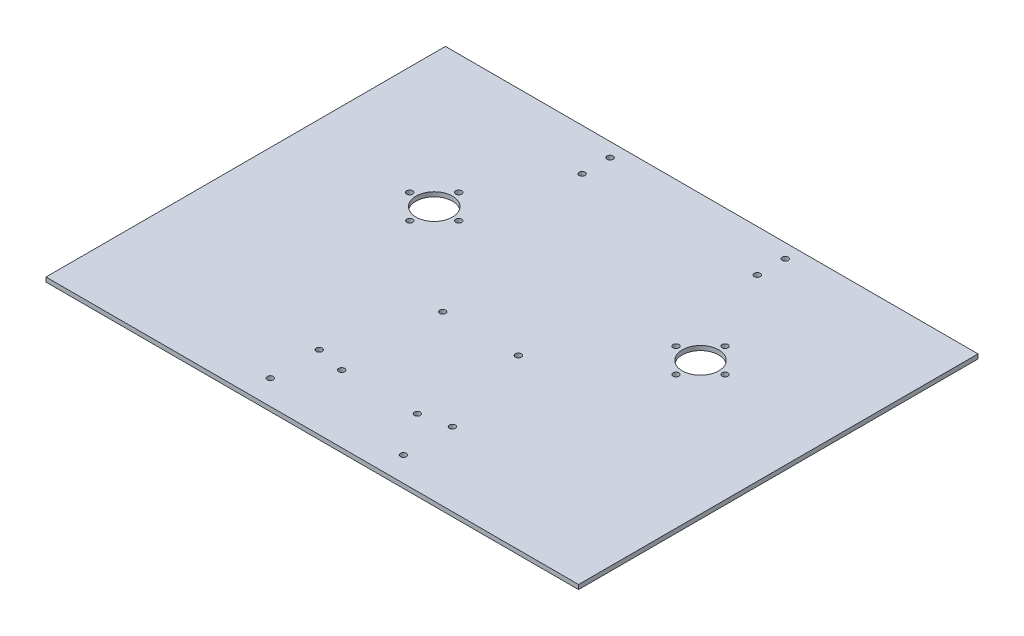
ISO-10303-21;
HEADER;
FILE_DESCRIPTION(('STEP AP214'),'2;1');
FILE_NAME('part.step','',(''),(''),'','','');
FILE_SCHEMA(('AUTOMOTIVE_DESIGN { 1 0 10303 214 1 1 1 1 }'));
ENDSEC;
DATA;
#1=APPLICATION_CONTEXT('core data for automotive mechanical design processes');
#2=APPLICATION_PROTOCOL_DEFINITION('international standard','automotive_design',2000,#1);
#3=PRODUCT_CONTEXT('',#1,'mechanical');
#4=PRODUCT('Part','Part','',(#3));
#5=PRODUCT_RELATED_PRODUCT_CATEGORY('part','',(#4));
#6=PRODUCT_DEFINITION_FORMATION('','',#4);
#7=PRODUCT_DEFINITION_CONTEXT('part definition',#1,'design');
#8=PRODUCT_DEFINITION('design','',#6,#7);
#9=PRODUCT_DEFINITION_SHAPE('','',#8);
#10=(LENGTH_UNIT() NAMED_UNIT(*) SI_UNIT(.MILLI.,.METRE.));
#11=(NAMED_UNIT(*) PLANE_ANGLE_UNIT() SI_UNIT($,.RADIAN.));
#12=(NAMED_UNIT(*) SI_UNIT($,.STERADIAN.) SOLID_ANGLE_UNIT());
#13=UNCERTAINTY_MEASURE_WITH_UNIT(LENGTH_MEASURE(1.E-05),#10,'distance_accuracy_value','');
#14=(GEOMETRIC_REPRESENTATION_CONTEXT(3) GLOBAL_UNCERTAINTY_ASSIGNED_CONTEXT((#13)) GLOBAL_UNIT_ASSIGNED_CONTEXT((#10,
#11,#12)) REPRESENTATION_CONTEXT('',''));
#15=CARTESIAN_POINT('',(0.,0.,0.));
#16=DIRECTION('',(0.,0.,1.));
#17=DIRECTION('',(1.,0.,0.));
#18=AXIS2_PLACEMENT_3D('',#15,#16,#17);
#19=CARTESIAN_POINT('',(0.,3.175,0.));
#20=DIRECTION('',(0.,-1.,0.));
#21=DIRECTION('',(0.,0.,-1.));
#22=AXIS2_PLACEMENT_3D('',#19,#20,#21);
#23=PLANE('',#22);
#24=DIRECTION('',(0.,0.,-1.));
#25=VECTOR('',#24,1.);
#26=CARTESIAN_POINT('',(190.,3.175,142.5));
#27=LINE('',#26,#25);
#28=CARTESIAN_POINT('',(190.,3.175,142.5));
#29=VERTEX_POINT('',#28);
#30=CARTESIAN_POINT('',(190.,3.175,-142.5));
#31=VERTEX_POINT('',#30);
#32=EDGE_CURVE('E98',#29,#31,#27,.T.);
#33=ORIENTED_EDGE('',*,*,#32,.T.);
#34=DIRECTION('',(-1.,0.,0.));
#35=VECTOR('',#34,1.);
#36=CARTESIAN_POINT('',(-190.,3.175,-142.5));
#37=LINE('',#36,#35);
#38=CARTESIAN_POINT('',(-190.,3.175,-142.5));
#39=VERTEX_POINT('',#38);
#40=EDGE_CURVE('E93',#31,#39,#37,.T.);
#41=ORIENTED_EDGE('',*,*,#40,.T.);
#42=DIRECTION('',(0.,0.,1.));
#43=VECTOR('',#42,1.);
#44=CARTESIAN_POINT('',(-190.,3.175,142.5));
#45=LINE('',#44,#43);
#46=CARTESIAN_POINT('',(-190.,3.175,142.5));
#47=VERTEX_POINT('',#46);
#48=EDGE_CURVE('E96',#39,#47,#45,.T.);
#49=ORIENTED_EDGE('',*,*,#48,.T.);
#50=DIRECTION('',(1.,0.,0.));
#51=VECTOR('',#50,1.);
#52=CARTESIAN_POINT('',(-190.,3.175,142.5));
#53=LINE('',#52,#51);
#54=EDGE_CURVE('E63',#47,#29,#53,.T.);
#55=ORIENTED_EDGE('',*,*,#54,.T.);
#56=EDGE_LOOP('',(#33,#41,#49,#55));
#57=FACE_BOUND('',#56,.T.);
#58=CARTESIAN_POINT('',(-95.,3.175,-39.5));
#59=DIRECTION('',(0.,1.,0.));
#60=DIRECTION('',(0.,0.,1.));
#61=AXIS2_PLACEMENT_3D('',#58,#59,#60);
#62=CIRCLE('',#61,13.);
#63=CARTESIAN_POINT('',(-95.,3.175,-26.5));
#64=VERTEX_POINT('',#63);
#65=EDGE_CURVE('E118',#64,#64,#62,.T.);
#66=ORIENTED_EDGE('',*,*,#65,.F.);
#67=EDGE_LOOP('',(#66));
#68=FACE_BOUND('',#67,.T.);
#69=CARTESIAN_POINT('',(-112.5,3.175,-39.4999999999999));
#70=DIRECTION('',(0.,1.,0.));
#71=DIRECTION('',(0.,0.,1.));
#72=AXIS2_PLACEMENT_3D('',#69,#70,#71);
#73=CIRCLE('',#72,2.125);
#74=CARTESIAN_POINT('',(-112.5,3.175,-37.3749999999999));
#75=VERTEX_POINT('',#74);
#76=EDGE_CURVE('E140',#75,#75,#73,.T.);
#77=ORIENTED_EDGE('',*,*,#76,.F.);
#78=EDGE_LOOP('',(#77));
#79=FACE_BOUND('',#78,.T.);
#80=CARTESIAN_POINT('',(-47.5,3.175,125.));
#81=DIRECTION('',(0.,1.,0.));
#82=DIRECTION('',(0.,0.,1.));
#83=AXIS2_PLACEMENT_3D('',#80,#81,#82);
#84=CIRCLE('',#83,2.125);
#85=CARTESIAN_POINT('',(-47.5,3.175,127.125));
#86=VERTEX_POINT('',#85);
#87=EDGE_CURVE('E148',#86,#86,#84,.T.);
#88=ORIENTED_EDGE('',*,*,#87,.F.);
#89=EDGE_LOOP('',(#88));
#90=FACE_BOUND('',#89,.T.);
#91=CARTESIAN_POINT('',(-62.5,3.175,-132.5));
#92=DIRECTION('',(0.,1.,0.));
#93=DIRECTION('',(0.,0.,1.));
#94=AXIS2_PLACEMENT_3D('',#91,#92,#93);
#95=CIRCLE('',#94,2.125);
#96=CARTESIAN_POINT('',(-62.5,3.175,-130.375));
#97=VERTEX_POINT('',#96);
#98=EDGE_CURVE('E156',#97,#97,#95,.T.);
#99=ORIENTED_EDGE('',*,*,#98,.F.);
#100=EDGE_LOOP('',(#99));
#101=FACE_BOUND('',#100,.T.);
#102=CARTESIAN_POINT('',(-95.,3.175,-57.));
#103=DIRECTION('',(0.,1.,0.));
#104=DIRECTION('',(0.,0.,1.));
#105=AXIS2_PLACEMENT_3D('',#102,#103,#104);
#106=CIRCLE('',#105,2.125);
#107=CARTESIAN_POINT('',(-95.,3.175,-54.875));
#108=VERTEX_POINT('',#107);
#109=EDGE_CURVE('E164',#108,#108,#106,.T.);
#110=ORIENTED_EDGE('',*,*,#109,.F.);
#111=EDGE_LOOP('',(#110));
#112=FACE_BOUND('',#111,.T.);
#113=CARTESIAN_POINT('',(-47.4999999999999,3.175,90.));
#114=DIRECTION('',(0.,1.,0.));
#115=DIRECTION('',(0.,0.,1.));
#116=AXIS2_PLACEMENT_3D('',#113,#114,#115);
#117=CIRCLE('',#116,2.125);
#118=CARTESIAN_POINT('',(-47.4999999999999,3.175,92.125));
#119=VERTEX_POINT('',#118);
#120=EDGE_CURVE('E172',#119,#119,#117,.T.);
#121=ORIENTED_EDGE('',*,*,#120,.F.);
#122=EDGE_LOOP('',(#121));
#123=FACE_BOUND('',#122,.T.);
#124=CARTESIAN_POINT('',(-77.5,3.175,-39.5));
#125=DIRECTION('',(0.,1.,0.));
#126=DIRECTION('',(0.,0.,1.));
#127=AXIS2_PLACEMENT_3D('',#124,#125,#126);
#128=CIRCLE('',#127,2.125);
#129=CARTESIAN_POINT('',(-77.5,3.175,-37.375));
#130=VERTEX_POINT('',#129);
#131=EDGE_CURVE('E180',#130,#130,#128,.T.);
#132=ORIENTED_EDGE('',*,*,#131,.F.);
#133=EDGE_LOOP('',(#132));
#134=FACE_BOUND('',#133,.T.);
#135=CARTESIAN_POINT('',(-95.0000000000001,3.175,-22.));
#136=DIRECTION('',(0.,1.,0.));
#137=DIRECTION('',(0.,0.,1.));
#138=AXIS2_PLACEMENT_3D('',#135,#136,#137);
#139=CIRCLE('',#138,2.125);
#140=CARTESIAN_POINT('',(-95.0000000000001,3.175,-19.875));
#141=VERTEX_POINT('',#140);
#142=EDGE_CURVE('E188',#141,#141,#139,.T.);
#143=ORIENTED_EDGE('',*,*,#142,.F.);
#144=EDGE_LOOP('',(#143));
#145=FACE_BOUND('',#144,.T.);
#146=CARTESIAN_POINT('',(-62.5,3.175,-112.5));
#147=DIRECTION('',(0.,1.,0.));
#148=DIRECTION('',(0.,0.,1.));
#149=AXIS2_PLACEMENT_3D('',#146,#147,#148);
#150=CIRCLE('',#149,2.125);
#151=CARTESIAN_POINT('',(-62.5,3.175,-110.375));
#152=VERTEX_POINT('',#151);
#153=EDGE_CURVE('E196',#152,#152,#150,.T.);
#154=ORIENTED_EDGE('',*,*,#153,.F.);
#155=EDGE_LOOP('',(#154));
#156=FACE_BOUND('',#155,.T.);
#157=CARTESIAN_POINT('',(47.5,3.175,90.));
#158=DIRECTION('',(0.,1.,0.));
#159=DIRECTION('',(0.,0.,-1.));
#160=AXIS2_PLACEMENT_3D('',#157,#158,#159);
#161=CIRCLE('',#160,2.125);
#162=CARTESIAN_POINT('',(47.5,3.175,87.875));
#163=VERTEX_POINT('',#162);
#164=EDGE_CURVE('E204',#163,#163,#161,.T.);
#165=ORIENTED_EDGE('',*,*,#164,.F.);
#166=EDGE_LOOP('',(#165));
#167=FACE_BOUND('',#166,.T.);
#168=CARTESIAN_POINT('',(47.5,3.175,125.));
#169=DIRECTION('',(0.,1.,0.));
#170=DIRECTION('',(0.,0.,-1.));
#171=AXIS2_PLACEMENT_3D('',#168,#169,#170);
#172=CIRCLE('',#171,2.125);
#173=CARTESIAN_POINT('',(47.5,3.175,122.875));
#174=VERTEX_POINT('',#173);
#175=EDGE_CURVE('E212',#174,#174,#172,.T.);
#176=ORIENTED_EDGE('',*,*,#175,.F.);
#177=EDGE_LOOP('',(#176));
#178=FACE_BOUND('',#177,.T.);
#179=CARTESIAN_POINT('',(95.0000000000001,3.175,-22.));
#180=DIRECTION('',(0.,1.,0.));
#181=DIRECTION('',(0.,0.,-1.));
#182=AXIS2_PLACEMENT_3D('',#179,#180,#181);
#183=CIRCLE('',#182,2.125);
#184=CARTESIAN_POINT('',(95.0000000000001,3.175,-24.125));
#185=VERTEX_POINT('',#184);
#186=EDGE_CURVE('E220',#185,#185,#183,.T.);
#187=ORIENTED_EDGE('',*,*,#186,.F.);
#188=EDGE_LOOP('',(#187));
#189=FACE_BOUND('',#188,.T.);
#190=CARTESIAN_POINT('',(77.4999999999999,3.175,-39.5));
#191=DIRECTION('',(0.,1.,0.));
#192=DIRECTION('',(0.,0.,-1.));
#193=AXIS2_PLACEMENT_3D('',#190,#191,#192);
#194=CIRCLE('',#193,2.125);
#195=CARTESIAN_POINT('',(77.4999999999999,3.175,-41.625));
#196=VERTEX_POINT('',#195);
#197=EDGE_CURVE('E228',#196,#196,#194,.T.);
#198=ORIENTED_EDGE('',*,*,#197,.F.);
#199=EDGE_LOOP('',(#198));
#200=FACE_BOUND('',#199,.T.);
#201=CARTESIAN_POINT('',(112.5,3.175,-39.4999999999999));
#202=DIRECTION('',(0.,1.,0.));
#203=DIRECTION('',(0.,0.,-1.));
#204=AXIS2_PLACEMENT_3D('',#201,#202,#203);
#205=CIRCLE('',#204,2.125);
#206=CARTESIAN_POINT('',(112.5,3.175,-41.625));
#207=VERTEX_POINT('',#206);
#208=EDGE_CURVE('E236',#207,#207,#205,.T.);
#209=ORIENTED_EDGE('',*,*,#208,.F.);
#210=EDGE_LOOP('',(#209));
#211=FACE_BOUND('',#210,.T.);
#212=CARTESIAN_POINT('',(94.9999999999999,3.175,-57.));
#213=DIRECTION('',(0.,1.,0.));
#214=DIRECTION('',(0.,0.,-1.));
#215=AXIS2_PLACEMENT_3D('',#212,#213,#214);
#216=CIRCLE('',#215,2.125);
#217=CARTESIAN_POINT('',(94.9999999999999,3.175,-59.125));
#218=VERTEX_POINT('',#217);
#219=EDGE_CURVE('E244',#218,#218,#216,.T.);
#220=ORIENTED_EDGE('',*,*,#219,.F.);
#221=EDGE_LOOP('',(#220));
#222=FACE_BOUND('',#221,.T.);
#223=CARTESIAN_POINT('',(94.9999999999999,3.175,-39.5));
#224=DIRECTION('',(0.,1.,0.));
#225=DIRECTION('',(0.,0.,-1.));
#226=AXIS2_PLACEMENT_3D('',#223,#224,#225);
#227=CIRCLE('',#226,13.);
#228=CARTESIAN_POINT('',(94.9999999999999,3.175,-52.5));
#229=VERTEX_POINT('',#228);
#230=EDGE_CURVE('E252',#229,#229,#227,.T.);
#231=ORIENTED_EDGE('',*,*,#230,.F.);
#232=EDGE_LOOP('',(#231));
#233=FACE_BOUND('',#232,.T.);
#234=CARTESIAN_POINT('',(62.4999999999999,3.175,-112.5));
#235=DIRECTION('',(0.,1.,0.));
#236=DIRECTION('',(0.,0.,-1.));
#237=AXIS2_PLACEMENT_3D('',#234,#235,#236);
#238=CIRCLE('',#237,2.125);
#239=CARTESIAN_POINT('',(62.4999999999999,3.175,-114.625));
#240=VERTEX_POINT('',#239);
#241=EDGE_CURVE('E260',#240,#240,#238,.T.);
#242=ORIENTED_EDGE('',*,*,#241,.F.);
#243=EDGE_LOOP('',(#242));
#244=FACE_BOUND('',#243,.T.);
#245=CARTESIAN_POINT('',(62.4999999999999,3.175,-132.5));
#246=DIRECTION('',(0.,1.,0.));
#247=DIRECTION('',(0.,0.,-1.));
#248=AXIS2_PLACEMENT_3D('',#245,#246,#247);
#249=CIRCLE('',#248,2.125);
#250=CARTESIAN_POINT('',(62.4999999999999,3.175,-134.625));
#251=VERTEX_POINT('',#250);
#252=EDGE_CURVE('E268',#251,#251,#249,.T.);
#253=ORIENTED_EDGE('',*,*,#252,.F.);
#254=EDGE_LOOP('',(#253));
#255=FACE_BOUND('',#254,.T.);
#256=CARTESIAN_POINT('',(-27.,3.175,94.5));
#257=DIRECTION('',(0.,1.,0.));
#258=DIRECTION('',(0.,0.,1.));
#259=AXIS2_PLACEMENT_3D('',#256,#257,#258);
#260=CIRCLE('',#259,2.125);
#261=CARTESIAN_POINT('',(-27.,3.175,96.625));
#262=VERTEX_POINT('',#261);
#263=EDGE_CURVE('E276',#262,#262,#260,.T.);
#264=ORIENTED_EDGE('',*,*,#263,.F.);
#265=EDGE_LOOP('',(#264));
#266=FACE_BOUND('',#265,.T.);
#267=CARTESIAN_POINT('',(-27.,3.175,22.5));
#268=DIRECTION('',(0.,1.,0.));
#269=DIRECTION('',(0.,0.,1.));
#270=AXIS2_PLACEMENT_3D('',#267,#268,#269);
#271=CIRCLE('',#270,2.125);
#272=CARTESIAN_POINT('',(-27.,3.175,24.625));
#273=VERTEX_POINT('',#272);
#274=EDGE_CURVE('E284',#273,#273,#271,.T.);
#275=ORIENTED_EDGE('',*,*,#274,.F.);
#276=EDGE_LOOP('',(#275));
#277=FACE_BOUND('',#276,.T.);
#278=CARTESIAN_POINT('',(26.9999999999999,3.175,94.5));
#279=DIRECTION('',(0.,1.,0.));
#280=DIRECTION('',(0.,0.,-1.));
#281=AXIS2_PLACEMENT_3D('',#278,#279,#280);
#282=CIRCLE('',#281,2.125);
#283=CARTESIAN_POINT('',(26.9999999999999,3.175,92.375));
#284=VERTEX_POINT('',#283);
#285=EDGE_CURVE('E292',#284,#284,#282,.T.);
#286=ORIENTED_EDGE('',*,*,#285,.F.);
#287=EDGE_LOOP('',(#286));
#288=FACE_BOUND('',#287,.T.);
#289=CARTESIAN_POINT('',(26.9999999999999,3.175,22.5));
#290=DIRECTION('',(0.,1.,0.));
#291=DIRECTION('',(0.,0.,-1.));
#292=AXIS2_PLACEMENT_3D('',#289,#290,#291);
#293=CIRCLE('',#292,2.125);
#294=CARTESIAN_POINT('',(26.9999999999999,3.175,20.375));
#295=VERTEX_POINT('',#294);
#296=EDGE_CURVE('E300',#295,#295,#293,.T.);
#297=ORIENTED_EDGE('',*,*,#296,.F.);
#298=EDGE_LOOP('',(#297));
#299=FACE_BOUND('',#298,.T.);
#300=ADVANCED_FACE('F45',(#57,#68,#79,#90,#101,#112,#123,#134,#145,#156,#167,#178,#189,#200,
#211,#222,#233,#244,#255,#266,#277,#288,#299),#23,.F.);
#301=CARTESIAN_POINT('',(0.,0.,0.));
#302=DIRECTION('',(0.,-1.,0.));
#303=DIRECTION('',(0.,0.,-1.));
#304=AXIS2_PLACEMENT_3D('',#301,#302,#303);
#305=PLANE('',#304);
#306=CARTESIAN_POINT('',(26.9999999999999,0.,94.5));
#307=DIRECTION('',(0.,1.,0.));
#308=DIRECTION('',(0.,0.,-1.));
#309=AXIS2_PLACEMENT_3D('',#306,#307,#308);
#310=CIRCLE('',#309,2.125);
#311=CARTESIAN_POINT('',(26.9999999999999,0.,92.375));
#312=VERTEX_POINT('',#311);
#313=EDGE_CURVE('E296',#312,#312,#310,.T.);
#314=ORIENTED_EDGE('',*,*,#313,.T.);
#315=EDGE_LOOP('',(#314));
#316=FACE_BOUND('',#315,.T.);
#317=CARTESIAN_POINT('',(-27.,0.,94.5));
#318=DIRECTION('',(0.,1.,0.));
#319=DIRECTION('',(0.,0.,1.));
#320=AXIS2_PLACEMENT_3D('',#317,#318,#319);
#321=CIRCLE('',#320,2.125);
#322=CARTESIAN_POINT('',(-27.,0.,96.625));
#323=VERTEX_POINT('',#322);
#324=EDGE_CURVE('E280',#323,#323,#321,.T.);
#325=ORIENTED_EDGE('',*,*,#324,.T.);
#326=EDGE_LOOP('',(#325));
#327=FACE_BOUND('',#326,.T.);
#328=CARTESIAN_POINT('',(62.4999999999999,0.,-112.5));
#329=DIRECTION('',(0.,1.,0.));
#330=DIRECTION('',(0.,0.,-1.));
#331=AXIS2_PLACEMENT_3D('',#328,#329,#330);
#332=CIRCLE('',#331,2.125);
#333=CARTESIAN_POINT('',(62.4999999999999,0.,-114.625));
#334=VERTEX_POINT('',#333);
#335=EDGE_CURVE('E264',#334,#334,#332,.T.);
#336=ORIENTED_EDGE('',*,*,#335,.T.);
#337=EDGE_LOOP('',(#336));
#338=FACE_BOUND('',#337,.T.);
#339=CARTESIAN_POINT('',(94.9999999999999,0.,-57.));
#340=DIRECTION('',(0.,1.,0.));
#341=DIRECTION('',(0.,0.,-1.));
#342=AXIS2_PLACEMENT_3D('',#339,#340,#341);
#343=CIRCLE('',#342,2.125);
#344=CARTESIAN_POINT('',(94.9999999999999,0.,-59.125));
#345=VERTEX_POINT('',#344);
#346=EDGE_CURVE('E248',#345,#345,#343,.T.);
#347=ORIENTED_EDGE('',*,*,#346,.T.);
#348=EDGE_LOOP('',(#347));
#349=FACE_BOUND('',#348,.T.);
#350=CARTESIAN_POINT('',(77.4999999999999,0.,-39.5));
#351=DIRECTION('',(0.,1.,0.));
#352=DIRECTION('',(0.,0.,-1.));
#353=AXIS2_PLACEMENT_3D('',#350,#351,#352);
#354=CIRCLE('',#353,2.125);
#355=CARTESIAN_POINT('',(77.4999999999999,0.,-41.625));
#356=VERTEX_POINT('',#355);
#357=EDGE_CURVE('E232',#356,#356,#354,.T.);
#358=ORIENTED_EDGE('',*,*,#357,.T.);
#359=EDGE_LOOP('',(#358));
#360=FACE_BOUND('',#359,.T.);
#361=CARTESIAN_POINT('',(47.5,0.,125.));
#362=DIRECTION('',(0.,1.,0.));
#363=DIRECTION('',(0.,0.,-1.));
#364=AXIS2_PLACEMENT_3D('',#361,#362,#363);
#365=CIRCLE('',#364,2.125);
#366=CARTESIAN_POINT('',(47.5,0.,122.875));
#367=VERTEX_POINT('',#366);
#368=EDGE_CURVE('E216',#367,#367,#365,.T.);
#369=ORIENTED_EDGE('',*,*,#368,.T.);
#370=EDGE_LOOP('',(#369));
#371=FACE_BOUND('',#370,.T.);
#372=CARTESIAN_POINT('',(-62.5,0.,-112.5));
#373=DIRECTION('',(0.,1.,0.));
#374=DIRECTION('',(0.,0.,1.));
#375=AXIS2_PLACEMENT_3D('',#372,#373,#374);
#376=CIRCLE('',#375,2.125);
#377=CARTESIAN_POINT('',(-62.5,0.,-110.375));
#378=VERTEX_POINT('',#377);
#379=EDGE_CURVE('E200',#378,#378,#376,.T.);
#380=ORIENTED_EDGE('',*,*,#379,.T.);
#381=EDGE_LOOP('',(#380));
#382=FACE_BOUND('',#381,.T.);
#383=CARTESIAN_POINT('',(-77.5,0.,-39.5));
#384=DIRECTION('',(0.,1.,0.));
#385=DIRECTION('',(0.,0.,1.));
#386=AXIS2_PLACEMENT_3D('',#383,#384,#385);
#387=CIRCLE('',#386,2.125);
#388=CARTESIAN_POINT('',(-77.5,0.,-37.375));
#389=VERTEX_POINT('',#388);
#390=EDGE_CURVE('E184',#389,#389,#387,.T.);
#391=ORIENTED_EDGE('',*,*,#390,.T.);
#392=EDGE_LOOP('',(#391));
#393=FACE_BOUND('',#392,.T.);
#394=CARTESIAN_POINT('',(-95.,0.,-57.));
#395=DIRECTION('',(0.,1.,0.));
#396=DIRECTION('',(0.,0.,1.));
#397=AXIS2_PLACEMENT_3D('',#394,#395,#396);
#398=CIRCLE('',#397,2.125);
#399=CARTESIAN_POINT('',(-95.,0.,-54.875));
#400=VERTEX_POINT('',#399);
#401=EDGE_CURVE('E168',#400,#400,#398,.T.);
#402=ORIENTED_EDGE('',*,*,#401,.T.);
#403=EDGE_LOOP('',(#402));
#404=FACE_BOUND('',#403,.T.);
#405=CARTESIAN_POINT('',(-47.5,0.,125.));
#406=DIRECTION('',(0.,1.,0.));
#407=DIRECTION('',(0.,0.,1.));
#408=AXIS2_PLACEMENT_3D('',#405,#406,#407);
#409=CIRCLE('',#408,2.125);
#410=CARTESIAN_POINT('',(-47.5,0.,127.125));
#411=VERTEX_POINT('',#410);
#412=EDGE_CURVE('E152',#411,#411,#409,.T.);
#413=ORIENTED_EDGE('',*,*,#412,.T.);
#414=EDGE_LOOP('',(#413));
#415=FACE_BOUND('',#414,.T.);
#416=CARTESIAN_POINT('',(-95.,0.,-39.5));
#417=DIRECTION('',(0.,1.,0.));
#418=DIRECTION('',(0.,0.,1.));
#419=AXIS2_PLACEMENT_3D('',#416,#417,#418);
#420=CIRCLE('',#419,13.);
#421=CARTESIAN_POINT('',(-95.,0.,-26.5));
#422=VERTEX_POINT('',#421);
#423=EDGE_CURVE('E136',#422,#422,#420,.T.);
#424=ORIENTED_EDGE('',*,*,#423,.T.);
#425=EDGE_LOOP('',(#424));
#426=FACE_BOUND('',#425,.T.);
#427=DIRECTION('',(0.,0.,-1.));
#428=VECTOR('',#427,1.);
#429=CARTESIAN_POINT('',(190.,0.,142.5));
#430=LINE('',#429,#428);
#431=CARTESIAN_POINT('',(190.,0.,142.5));
#432=VERTEX_POINT('',#431);
#433=CARTESIAN_POINT('',(190.,0.,-142.5));
#434=VERTEX_POINT('',#433);
#435=EDGE_CURVE('E114',#432,#434,#430,.T.);
#436=ORIENTED_EDGE('',*,*,#435,.F.);
#437=DIRECTION('',(1.,0.,0.));
#438=VECTOR('',#437,1.);
#439=CARTESIAN_POINT('',(-190.,0.,142.5));
#440=LINE('',#439,#438);
#441=CARTESIAN_POINT('',(-190.,0.,142.5));
#442=VERTEX_POINT('',#441);
#443=EDGE_CURVE('E86',#442,#432,#440,.T.);
#444=ORIENTED_EDGE('',*,*,#443,.F.);
#445=DIRECTION('',(0.,0.,1.));
#446=VECTOR('',#445,1.);
#447=CARTESIAN_POINT('',(-190.,0.,142.5));
#448=LINE('',#447,#446);
#449=CARTESIAN_POINT('',(-190.,0.,-142.5));
#450=VERTEX_POINT('',#449);
#451=EDGE_CURVE('E80',#450,#442,#448,.T.);
#452=ORIENTED_EDGE('',*,*,#451,.F.);
#453=DIRECTION('',(-1.,0.,0.));
#454=VECTOR('',#453,1.);
#455=CARTESIAN_POINT('',(-190.,0.,-142.5));
#456=LINE('',#455,#454);
#457=EDGE_CURVE('E103',#434,#450,#456,.T.);
#458=ORIENTED_EDGE('',*,*,#457,.F.);
#459=EDGE_LOOP('',(#436,#444,#452,#458));
#460=FACE_BOUND('',#459,.T.);
#461=CARTESIAN_POINT('',(-112.5,0.,-39.4999999999999));
#462=DIRECTION('',(0.,1.,0.));
#463=DIRECTION('',(0.,0.,1.));
#464=AXIS2_PLACEMENT_3D('',#461,#462,#463);
#465=CIRCLE('',#464,2.125);
#466=CARTESIAN_POINT('',(-112.5,0.,-37.3749999999999));
#467=VERTEX_POINT('',#466);
#468=EDGE_CURVE('E144',#467,#467,#465,.T.);
#469=ORIENTED_EDGE('',*,*,#468,.T.);
#470=EDGE_LOOP('',(#469));
#471=FACE_BOUND('',#470,.T.);
#472=CARTESIAN_POINT('',(-62.5,0.,-132.5));
#473=DIRECTION('',(0.,1.,0.));
#474=DIRECTION('',(0.,0.,1.));
#475=AXIS2_PLACEMENT_3D('',#472,#473,#474);
#476=CIRCLE('',#475,2.125);
#477=CARTESIAN_POINT('',(-62.5,0.,-130.375));
#478=VERTEX_POINT('',#477);
#479=EDGE_CURVE('E160',#478,#478,#476,.T.);
#480=ORIENTED_EDGE('',*,*,#479,.T.);
#481=EDGE_LOOP('',(#480));
#482=FACE_BOUND('',#481,.T.);
#483=CARTESIAN_POINT('',(-47.4999999999999,0.,90.));
#484=DIRECTION('',(0.,1.,0.));
#485=DIRECTION('',(0.,0.,1.));
#486=AXIS2_PLACEMENT_3D('',#483,#484,#485);
#487=CIRCLE('',#486,2.125);
#488=CARTESIAN_POINT('',(-47.4999999999999,0.,92.125));
#489=VERTEX_POINT('',#488);
#490=EDGE_CURVE('E176',#489,#489,#487,.T.);
#491=ORIENTED_EDGE('',*,*,#490,.T.);
#492=EDGE_LOOP('',(#491));
#493=FACE_BOUND('',#492,.T.);
#494=CARTESIAN_POINT('',(-95.0000000000001,0.,-22.));
#495=DIRECTION('',(0.,1.,0.));
#496=DIRECTION('',(0.,0.,1.));
#497=AXIS2_PLACEMENT_3D('',#494,#495,#496);
#498=CIRCLE('',#497,2.125);
#499=CARTESIAN_POINT('',(-95.0000000000001,0.,-19.875));
#500=VERTEX_POINT('',#499);
#501=EDGE_CURVE('E192',#500,#500,#498,.T.);
#502=ORIENTED_EDGE('',*,*,#501,.T.);
#503=EDGE_LOOP('',(#502));
#504=FACE_BOUND('',#503,.T.);
#505=CARTESIAN_POINT('',(47.5,0.,90.));
#506=DIRECTION('',(0.,1.,0.));
#507=DIRECTION('',(0.,0.,-1.));
#508=AXIS2_PLACEMENT_3D('',#505,#506,#507);
#509=CIRCLE('',#508,2.125);
#510=CARTESIAN_POINT('',(47.5,0.,87.875));
#511=VERTEX_POINT('',#510);
#512=EDGE_CURVE('E208',#511,#511,#509,.T.);
#513=ORIENTED_EDGE('',*,*,#512,.T.);
#514=EDGE_LOOP('',(#513));
#515=FACE_BOUND('',#514,.T.);
#516=CARTESIAN_POINT('',(95.0000000000001,0.,-22.));
#517=DIRECTION('',(0.,1.,0.));
#518=DIRECTION('',(0.,0.,-1.));
#519=AXIS2_PLACEMENT_3D('',#516,#517,#518);
#520=CIRCLE('',#519,2.125);
#521=CARTESIAN_POINT('',(95.0000000000001,0.,-24.125));
#522=VERTEX_POINT('',#521);
#523=EDGE_CURVE('E224',#522,#522,#520,.T.);
#524=ORIENTED_EDGE('',*,*,#523,.T.);
#525=EDGE_LOOP('',(#524));
#526=FACE_BOUND('',#525,.T.);
#527=CARTESIAN_POINT('',(112.5,0.,-39.4999999999999));
#528=DIRECTION('',(0.,1.,0.));
#529=DIRECTION('',(0.,0.,-1.));
#530=AXIS2_PLACEMENT_3D('',#527,#528,#529);
#531=CIRCLE('',#530,2.125);
#532=CARTESIAN_POINT('',(112.5,0.,-41.625));
#533=VERTEX_POINT('',#532);
#534=EDGE_CURVE('E240',#533,#533,#531,.T.);
#535=ORIENTED_EDGE('',*,*,#534,.T.);
#536=EDGE_LOOP('',(#535));
#537=FACE_BOUND('',#536,.T.);
#538=CARTESIAN_POINT('',(94.9999999999999,0.,-39.5));
#539=DIRECTION('',(0.,1.,0.));
#540=DIRECTION('',(0.,0.,-1.));
#541=AXIS2_PLACEMENT_3D('',#538,#539,#540);
#542=CIRCLE('',#541,13.);
#543=CARTESIAN_POINT('',(94.9999999999999,0.,-52.5));
#544=VERTEX_POINT('',#543);
#545=EDGE_CURVE('E256',#544,#544,#542,.T.);
#546=ORIENTED_EDGE('',*,*,#545,.T.);
#547=EDGE_LOOP('',(#546));
#548=FACE_BOUND('',#547,.T.);
#549=CARTESIAN_POINT('',(62.4999999999999,0.,-132.5));
#550=DIRECTION('',(0.,1.,0.));
#551=DIRECTION('',(0.,0.,-1.));
#552=AXIS2_PLACEMENT_3D('',#549,#550,#551);
#553=CIRCLE('',#552,2.125);
#554=CARTESIAN_POINT('',(62.4999999999999,0.,-134.625));
#555=VERTEX_POINT('',#554);
#556=EDGE_CURVE('E272',#555,#555,#553,.T.);
#557=ORIENTED_EDGE('',*,*,#556,.T.);
#558=EDGE_LOOP('',(#557));
#559=FACE_BOUND('',#558,.T.);
#560=CARTESIAN_POINT('',(-27.,0.,22.5));
#561=DIRECTION('',(0.,1.,0.));
#562=DIRECTION('',(0.,0.,1.));
#563=AXIS2_PLACEMENT_3D('',#560,#561,#562);
#564=CIRCLE('',#563,2.125);
#565=CARTESIAN_POINT('',(-27.,0.,24.625));
#566=VERTEX_POINT('',#565);
#567=EDGE_CURVE('E288',#566,#566,#564,.T.);
#568=ORIENTED_EDGE('',*,*,#567,.T.);
#569=EDGE_LOOP('',(#568));
#570=FACE_BOUND('',#569,.T.);
#571=CARTESIAN_POINT('',(26.9999999999999,0.,22.5));
#572=DIRECTION('',(0.,1.,0.));
#573=DIRECTION('',(0.,0.,-1.));
#574=AXIS2_PLACEMENT_3D('',#571,#572,#573);
#575=CIRCLE('',#574,2.125);
#576=CARTESIAN_POINT('',(26.9999999999999,0.,20.375));
#577=VERTEX_POINT('',#576);
#578=EDGE_CURVE('E304',#577,#577,#575,.T.);
#579=ORIENTED_EDGE('',*,*,#578,.T.);
#580=EDGE_LOOP('',(#579));
#581=FACE_BOUND('',#580,.T.);
#582=ADVANCED_FACE('F131',(#316,#327,#338,#349,#360,#371,#382,#393,#404,#415,#426,#460,#471,
#482,#493,#504,#515,#526,#537,#548,#559,#570,#581),#305,.T.);
#583=CARTESIAN_POINT('',(190.,3.175,142.5));
#584=DIRECTION('',(-1.,0.,0.));
#585=DIRECTION('',(0.,0.,1.));
#586=AXIS2_PLACEMENT_3D('',#583,#584,#585);
#587=PLANE('',#586);
#588=ORIENTED_EDGE('',*,*,#435,.T.);
#589=DIRECTION('',(0.,-1.,0.));
#590=VECTOR('',#589,1.);
#591=CARTESIAN_POINT('',(190.,3.175,-142.5));
#592=LINE('',#591,#590);
#593=EDGE_CURVE('E11',#31,#434,#592,.T.);
#594=ORIENTED_EDGE('',*,*,#593,.F.);
#595=ORIENTED_EDGE('',*,*,#32,.F.);
#596=DIRECTION('',(0.,-1.,0.));
#597=VECTOR('',#596,1.);
#598=CARTESIAN_POINT('',(190.,3.175,142.5));
#599=LINE('',#598,#597);
#600=EDGE_CURVE('E110',#29,#432,#599,.T.);
#601=ORIENTED_EDGE('',*,*,#600,.T.);
#602=EDGE_LOOP('',(#588,#594,#595,#601));
#603=FACE_BOUND('',#602,.T.);
#604=ADVANCED_FACE('F47',(#603),#587,.F.);
#605=CARTESIAN_POINT('',(-190.,3.175,-142.5));
#606=DIRECTION('',(0.,0.,1.));
#607=DIRECTION('',(1.,0.,0.));
#608=AXIS2_PLACEMENT_3D('',#605,#606,#607);
#609=PLANE('',#608);
#610=ORIENTED_EDGE('',*,*,#457,.T.);
#611=DIRECTION('',(0.,-1.,0.));
#612=VECTOR('',#611,1.);
#613=CARTESIAN_POINT('',(-190.,3.175,-142.5));
#614=LINE('',#613,#612);
#615=EDGE_CURVE('E55',#39,#450,#614,.T.);
#616=ORIENTED_EDGE('',*,*,#615,.F.);
#617=ORIENTED_EDGE('',*,*,#40,.F.);
#618=ORIENTED_EDGE('',*,*,#593,.T.);
#619=EDGE_LOOP('',(#610,#616,#617,#618));
#620=FACE_BOUND('',#619,.T.);
#621=ADVANCED_FACE('F102',(#620),#609,.F.);
#622=CARTESIAN_POINT('',(-190.,3.175,142.5));
#623=DIRECTION('',(1.,0.,0.));
#624=DIRECTION('',(0.,0.,-1.));
#625=AXIS2_PLACEMENT_3D('',#622,#623,#624);
#626=PLANE('',#625);
#627=ORIENTED_EDGE('',*,*,#451,.T.);
#628=DIRECTION('',(0.,-1.,0.));
#629=VECTOR('',#628,1.);
#630=CARTESIAN_POINT('',(-190.,3.175,142.5));
#631=LINE('',#630,#629);
#632=EDGE_CURVE('E105',#47,#442,#631,.T.);
#633=ORIENTED_EDGE('',*,*,#632,.F.);
#634=ORIENTED_EDGE('',*,*,#48,.F.);
#635=ORIENTED_EDGE('',*,*,#615,.T.);
#636=EDGE_LOOP('',(#627,#633,#634,#635));
#637=FACE_BOUND('',#636,.T.);
#638=ADVANCED_FACE('F106',(#637),#626,.F.);
#639=CARTESIAN_POINT('',(-190.,3.175,142.5));
#640=DIRECTION('',(0.,0.,-1.));
#641=DIRECTION('',(-1.,0.,0.));
#642=AXIS2_PLACEMENT_3D('',#639,#640,#641);
#643=PLANE('',#642);
#644=ORIENTED_EDGE('',*,*,#443,.T.);
#645=ORIENTED_EDGE('',*,*,#600,.F.);
#646=ORIENTED_EDGE('',*,*,#54,.F.);
#647=ORIENTED_EDGE('',*,*,#632,.T.);
#648=EDGE_LOOP('',(#644,#645,#646,#647));
#649=FACE_BOUND('',#648,.T.);
#650=ADVANCED_FACE('F128',(#649),#643,.F.);
#651=CARTESIAN_POINT('',(-95.,3.175,-39.5));
#652=DIRECTION('',(0.,-1.,0.));
#653=DIRECTION('',(0.,0.,-1.));
#654=AXIS2_PLACEMENT_3D('',#651,#652,#653);
#655=CYLINDRICAL_SURFACE('',#654,13.);
#656=ORIENTED_EDGE('',*,*,#65,.T.);
#657=EDGE_LOOP('',(#656));
#658=FACE_BOUND('',#657,.T.);
#659=ORIENTED_EDGE('',*,*,#423,.F.);
#660=EDGE_LOOP('',(#659));
#661=FACE_BOUND('',#660,.T.);
#662=ADVANCED_FACE('F323',(#658,#661),#655,.F.);
#663=CARTESIAN_POINT('',(-112.5,3.175,-39.4999999999999));
#664=DIRECTION('',(0.,-1.,0.));
#665=DIRECTION('',(0.,0.,-1.));
#666=AXIS2_PLACEMENT_3D('',#663,#664,#665);
#667=CYLINDRICAL_SURFACE('',#666,2.125);
#668=ORIENTED_EDGE('',*,*,#76,.T.);
#669=EDGE_LOOP('',(#668));
#670=FACE_BOUND('',#669,.T.);
#671=ORIENTED_EDGE('',*,*,#468,.F.);
#672=EDGE_LOOP('',(#671));
#673=FACE_BOUND('',#672,.T.);
#674=ADVANCED_FACE('F368',(#670,#673),#667,.F.);
#675=CARTESIAN_POINT('',(-47.5,3.175,125.));
#676=DIRECTION('',(0.,-1.,0.));
#677=DIRECTION('',(0.,0.,-1.));
#678=AXIS2_PLACEMENT_3D('',#675,#676,#677);
#679=CYLINDRICAL_SURFACE('',#678,2.125);
#680=ORIENTED_EDGE('',*,*,#87,.T.);
#681=EDGE_LOOP('',(#680));
#682=FACE_BOUND('',#681,.T.);
#683=ORIENTED_EDGE('',*,*,#412,.F.);
#684=EDGE_LOOP('',(#683));
#685=FACE_BOUND('',#684,.T.);
#686=ADVANCED_FACE('F376',(#682,#685),#679,.F.);
#687=CARTESIAN_POINT('',(-62.5,3.175,-132.5));
#688=DIRECTION('',(0.,-1.,0.));
#689=DIRECTION('',(0.,0.,-1.));
#690=AXIS2_PLACEMENT_3D('',#687,#688,#689);
#691=CYLINDRICAL_SURFACE('',#690,2.125);
#692=ORIENTED_EDGE('',*,*,#98,.T.);
#693=EDGE_LOOP('',(#692));
#694=FACE_BOUND('',#693,.T.);
#695=ORIENTED_EDGE('',*,*,#479,.F.);
#696=EDGE_LOOP('',(#695));
#697=FACE_BOUND('',#696,.T.);
#698=ADVANCED_FACE('F384',(#694,#697),#691,.F.);
#699=CARTESIAN_POINT('',(-95.,3.175,-57.));
#700=DIRECTION('',(0.,-1.,0.));
#701=DIRECTION('',(0.,0.,-1.));
#702=AXIS2_PLACEMENT_3D('',#699,#700,#701);
#703=CYLINDRICAL_SURFACE('',#702,2.125);
#704=ORIENTED_EDGE('',*,*,#109,.T.);
#705=EDGE_LOOP('',(#704));
#706=FACE_BOUND('',#705,.T.);
#707=ORIENTED_EDGE('',*,*,#401,.F.);
#708=EDGE_LOOP('',(#707));
#709=FACE_BOUND('',#708,.T.);
#710=ADVANCED_FACE('F393',(#706,#709),#703,.F.);
#711=CARTESIAN_POINT('',(-47.4999999999999,3.175,90.));
#712=DIRECTION('',(0.,-1.,0.));
#713=DIRECTION('',(0.,0.,-1.));
#714=AXIS2_PLACEMENT_3D('',#711,#712,#713);
#715=CYLINDRICAL_SURFACE('',#714,2.125);
#716=ORIENTED_EDGE('',*,*,#120,.T.);
#717=EDGE_LOOP('',(#716));
#718=FACE_BOUND('',#717,.T.);
#719=ORIENTED_EDGE('',*,*,#490,.F.);
#720=EDGE_LOOP('',(#719));
#721=FACE_BOUND('',#720,.T.);
#722=ADVANCED_FACE('F402',(#718,#721),#715,.F.);
#723=CARTESIAN_POINT('',(-77.5,3.175,-39.5));
#724=DIRECTION('',(0.,-1.,0.));
#725=DIRECTION('',(0.,0.,-1.));
#726=AXIS2_PLACEMENT_3D('',#723,#724,#725);
#727=CYLINDRICAL_SURFACE('',#726,2.125);
#728=ORIENTED_EDGE('',*,*,#131,.T.);
#729=EDGE_LOOP('',(#728));
#730=FACE_BOUND('',#729,.T.);
#731=ORIENTED_EDGE('',*,*,#390,.F.);
#732=EDGE_LOOP('',(#731));
#733=FACE_BOUND('',#732,.T.);
#734=ADVANCED_FACE('F411',(#730,#733),#727,.F.);
#735=CARTESIAN_POINT('',(-95.0000000000001,3.175,-22.));
#736=DIRECTION('',(0.,-1.,0.));
#737=DIRECTION('',(0.,0.,-1.));
#738=AXIS2_PLACEMENT_3D('',#735,#736,#737);
#739=CYLINDRICAL_SURFACE('',#738,2.125);
#740=ORIENTED_EDGE('',*,*,#142,.T.);
#741=EDGE_LOOP('',(#740));
#742=FACE_BOUND('',#741,.T.);
#743=ORIENTED_EDGE('',*,*,#501,.F.);
#744=EDGE_LOOP('',(#743));
#745=FACE_BOUND('',#744,.T.);
#746=ADVANCED_FACE('F420',(#742,#745),#739,.F.);
#747=CARTESIAN_POINT('',(-62.5,3.175,-112.5));
#748=DIRECTION('',(0.,-1.,0.));
#749=DIRECTION('',(0.,0.,-1.));
#750=AXIS2_PLACEMENT_3D('',#747,#748,#749);
#751=CYLINDRICAL_SURFACE('',#750,2.125);
#752=ORIENTED_EDGE('',*,*,#153,.T.);
#753=EDGE_LOOP('',(#752));
#754=FACE_BOUND('',#753,.T.);
#755=ORIENTED_EDGE('',*,*,#379,.F.);
#756=EDGE_LOOP('',(#755));
#757=FACE_BOUND('',#756,.T.);
#758=ADVANCED_FACE('F429',(#754,#757),#751,.F.);
#759=CARTESIAN_POINT('',(47.5,3.175,90.));
#760=DIRECTION('',(0.,-1.,0.));
#761=DIRECTION('',(0.,0.,-1.));
#762=AXIS2_PLACEMENT_3D('',#759,#760,#761);
#763=CYLINDRICAL_SURFACE('',#762,2.125);
#764=ORIENTED_EDGE('',*,*,#164,.T.);
#765=EDGE_LOOP('',(#764));
#766=FACE_BOUND('',#765,.T.);
#767=ORIENTED_EDGE('',*,*,#512,.F.);
#768=EDGE_LOOP('',(#767));
#769=FACE_BOUND('',#768,.T.);
#770=ADVANCED_FACE('F438',(#766,#769),#763,.F.);
#771=CARTESIAN_POINT('',(47.5,3.175,125.));
#772=DIRECTION('',(0.,-1.,0.));
#773=DIRECTION('',(0.,0.,-1.));
#774=AXIS2_PLACEMENT_3D('',#771,#772,#773);
#775=CYLINDRICAL_SURFACE('',#774,2.125);
#776=ORIENTED_EDGE('',*,*,#175,.T.);
#777=EDGE_LOOP('',(#776));
#778=FACE_BOUND('',#777,.T.);
#779=ORIENTED_EDGE('',*,*,#368,.F.);
#780=EDGE_LOOP('',(#779));
#781=FACE_BOUND('',#780,.T.);
#782=ADVANCED_FACE('F447',(#778,#781),#775,.F.);
#783=CARTESIAN_POINT('',(95.0000000000001,3.175,-22.));
#784=DIRECTION('',(0.,-1.,0.));
#785=DIRECTION('',(0.,0.,-1.));
#786=AXIS2_PLACEMENT_3D('',#783,#784,#785);
#787=CYLINDRICAL_SURFACE('',#786,2.125);
#788=ORIENTED_EDGE('',*,*,#186,.T.);
#789=EDGE_LOOP('',(#788));
#790=FACE_BOUND('',#789,.T.);
#791=ORIENTED_EDGE('',*,*,#523,.F.);
#792=EDGE_LOOP('',(#791));
#793=FACE_BOUND('',#792,.T.);
#794=ADVANCED_FACE('F456',(#790,#793),#787,.F.);
#795=CARTESIAN_POINT('',(77.4999999999999,3.175,-39.5));
#796=DIRECTION('',(0.,-1.,0.));
#797=DIRECTION('',(0.,0.,-1.));
#798=AXIS2_PLACEMENT_3D('',#795,#796,#797);
#799=CYLINDRICAL_SURFACE('',#798,2.125);
#800=ORIENTED_EDGE('',*,*,#197,.T.);
#801=EDGE_LOOP('',(#800));
#802=FACE_BOUND('',#801,.T.);
#803=ORIENTED_EDGE('',*,*,#357,.F.);
#804=EDGE_LOOP('',(#803));
#805=FACE_BOUND('',#804,.T.);
#806=ADVANCED_FACE('F465',(#802,#805),#799,.F.);
#807=CARTESIAN_POINT('',(112.5,3.175,-39.4999999999999));
#808=DIRECTION('',(0.,-1.,0.));
#809=DIRECTION('',(0.,0.,-1.));
#810=AXIS2_PLACEMENT_3D('',#807,#808,#809);
#811=CYLINDRICAL_SURFACE('',#810,2.125);
#812=ORIENTED_EDGE('',*,*,#208,.T.);
#813=EDGE_LOOP('',(#812));
#814=FACE_BOUND('',#813,.T.);
#815=ORIENTED_EDGE('',*,*,#534,.F.);
#816=EDGE_LOOP('',(#815));
#817=FACE_BOUND('',#816,.T.);
#818=ADVANCED_FACE('F474',(#814,#817),#811,.F.);
#819=CARTESIAN_POINT('',(94.9999999999999,3.175,-57.));
#820=DIRECTION('',(0.,-1.,0.));
#821=DIRECTION('',(0.,0.,-1.));
#822=AXIS2_PLACEMENT_3D('',#819,#820,#821);
#823=CYLINDRICAL_SURFACE('',#822,2.125);
#824=ORIENTED_EDGE('',*,*,#219,.T.);
#825=EDGE_LOOP('',(#824));
#826=FACE_BOUND('',#825,.T.);
#827=ORIENTED_EDGE('',*,*,#346,.F.);
#828=EDGE_LOOP('',(#827));
#829=FACE_BOUND('',#828,.T.);
#830=ADVANCED_FACE('F483',(#826,#829),#823,.F.);
#831=CARTESIAN_POINT('',(94.9999999999999,3.175,-39.5));
#832=DIRECTION('',(0.,-1.,0.));
#833=DIRECTION('',(0.,0.,-1.));
#834=AXIS2_PLACEMENT_3D('',#831,#832,#833);
#835=CYLINDRICAL_SURFACE('',#834,13.);
#836=ORIENTED_EDGE('',*,*,#230,.T.);
#837=EDGE_LOOP('',(#836));
#838=FACE_BOUND('',#837,.T.);
#839=ORIENTED_EDGE('',*,*,#545,.F.);
#840=EDGE_LOOP('',(#839));
#841=FACE_BOUND('',#840,.T.);
#842=ADVANCED_FACE('F492',(#838,#841),#835,.F.);
#843=CARTESIAN_POINT('',(62.4999999999999,3.175,-112.5));
#844=DIRECTION('',(0.,-1.,0.));
#845=DIRECTION('',(0.,0.,-1.));
#846=AXIS2_PLACEMENT_3D('',#843,#844,#845);
#847=CYLINDRICAL_SURFACE('',#846,2.125);
#848=ORIENTED_EDGE('',*,*,#241,.T.);
#849=EDGE_LOOP('',(#848));
#850=FACE_BOUND('',#849,.T.);
#851=ORIENTED_EDGE('',*,*,#335,.F.);
#852=EDGE_LOOP('',(#851));
#853=FACE_BOUND('',#852,.T.);
#854=ADVANCED_FACE('F501',(#850,#853),#847,.F.);
#855=CARTESIAN_POINT('',(62.4999999999999,3.175,-132.5));
#856=DIRECTION('',(0.,-1.,0.));
#857=DIRECTION('',(0.,0.,-1.));
#858=AXIS2_PLACEMENT_3D('',#855,#856,#857);
#859=CYLINDRICAL_SURFACE('',#858,2.125);
#860=ORIENTED_EDGE('',*,*,#252,.T.);
#861=EDGE_LOOP('',(#860));
#862=FACE_BOUND('',#861,.T.);
#863=ORIENTED_EDGE('',*,*,#556,.F.);
#864=EDGE_LOOP('',(#863));
#865=FACE_BOUND('',#864,.T.);
#866=ADVANCED_FACE('F510',(#862,#865),#859,.F.);
#867=CARTESIAN_POINT('',(-27.,3.175,94.5));
#868=DIRECTION('',(0.,-1.,0.));
#869=DIRECTION('',(0.,0.,-1.));
#870=AXIS2_PLACEMENT_3D('',#867,#868,#869);
#871=CYLINDRICAL_SURFACE('',#870,2.125);
#872=ORIENTED_EDGE('',*,*,#263,.T.);
#873=EDGE_LOOP('',(#872));
#874=FACE_BOUND('',#873,.T.);
#875=ORIENTED_EDGE('',*,*,#324,.F.);
#876=EDGE_LOOP('',(#875));
#877=FACE_BOUND('',#876,.T.);
#878=ADVANCED_FACE('F519',(#874,#877),#871,.F.);
#879=CARTESIAN_POINT('',(-27.,3.175,22.5));
#880=DIRECTION('',(0.,-1.,0.));
#881=DIRECTION('',(0.,0.,-1.));
#882=AXIS2_PLACEMENT_3D('',#879,#880,#881);
#883=CYLINDRICAL_SURFACE('',#882,2.125);
#884=ORIENTED_EDGE('',*,*,#274,.T.);
#885=EDGE_LOOP('',(#884));
#886=FACE_BOUND('',#885,.T.);
#887=ORIENTED_EDGE('',*,*,#567,.F.);
#888=EDGE_LOOP('',(#887));
#889=FACE_BOUND('',#888,.T.);
#890=ADVANCED_FACE('F528',(#886,#889),#883,.F.);
#891=CARTESIAN_POINT('',(26.9999999999999,3.175,94.5));
#892=DIRECTION('',(0.,-1.,0.));
#893=DIRECTION('',(0.,0.,-1.));
#894=AXIS2_PLACEMENT_3D('',#891,#892,#893);
#895=CYLINDRICAL_SURFACE('',#894,2.125);
#896=ORIENTED_EDGE('',*,*,#285,.T.);
#897=EDGE_LOOP('',(#896));
#898=FACE_BOUND('',#897,.T.);
#899=ORIENTED_EDGE('',*,*,#313,.F.);
#900=EDGE_LOOP('',(#899));
#901=FACE_BOUND('',#900,.T.);
#902=ADVANCED_FACE('F537',(#898,#901),#895,.F.);
#903=CARTESIAN_POINT('',(26.9999999999999,3.175,22.5));
#904=DIRECTION('',(0.,-1.,0.));
#905=DIRECTION('',(0.,0.,-1.));
#906=AXIS2_PLACEMENT_3D('',#903,#904,#905);
#907=CYLINDRICAL_SURFACE('',#906,2.125);
#908=ORIENTED_EDGE('',*,*,#296,.T.);
#909=EDGE_LOOP('',(#908));
#910=FACE_BOUND('',#909,.T.);
#911=ORIENTED_EDGE('',*,*,#578,.F.);
#912=EDGE_LOOP('',(#911));
#913=FACE_BOUND('',#912,.T.);
#914=ADVANCED_FACE('F312',(#910,#913),#907,.F.);
#915=CLOSED_SHELL('',(#300,#582,#604,#621,#638,#650,#662,#674,#686,#698,#710,#722,#734,#746,
#758,#770,#782,#794,#806,#818,#830,#842,#854,#866,#878,#890,#902,#914));
#916=MANIFOLD_SOLID_BREP('B2',#915);
#917=ADVANCED_BREP_SHAPE_REPRESENTATION('',(#18,#916),#14);
#918=SHAPE_DEFINITION_REPRESENTATION(#9,#917);
ENDSEC;
END-ISO-10303-21;
